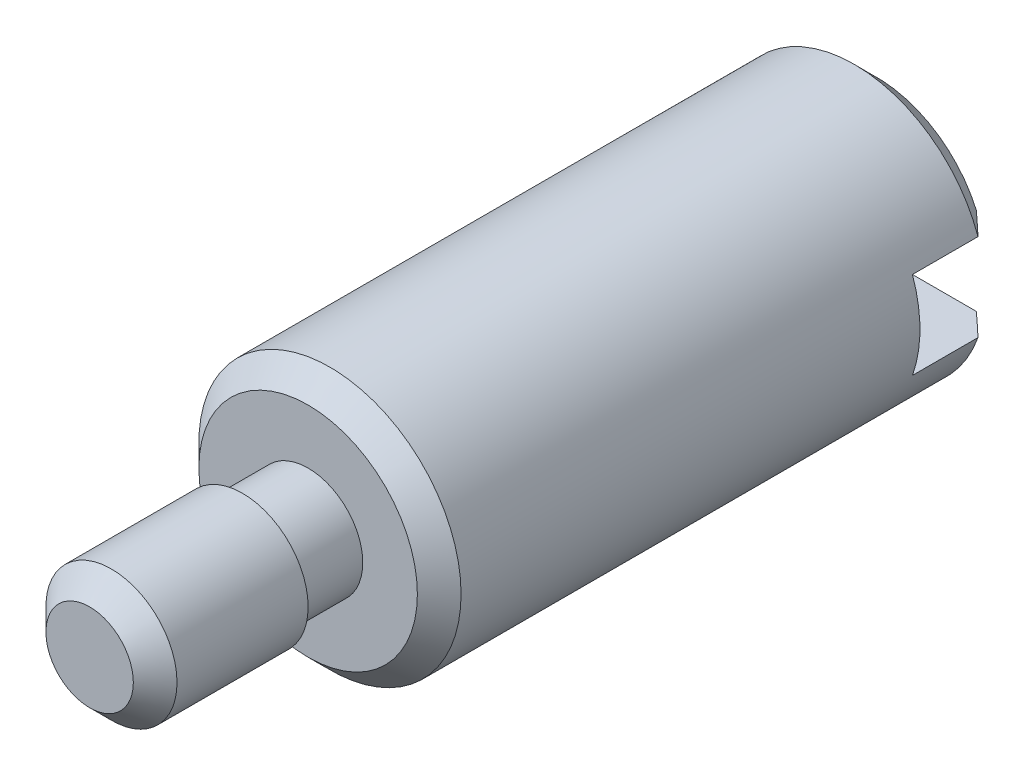
ISO-10303-21;
HEADER;
FILE_DESCRIPTION(('STEP AP214'),'2;1');
FILE_NAME('part.step','',(''),(''),'','','');
FILE_SCHEMA(('AUTOMOTIVE_DESIGN { 1 0 10303 214 1 1 1 1 }'));
ENDSEC;
DATA;
#1=APPLICATION_CONTEXT('core data for automotive mechanical design processes');
#2=APPLICATION_PROTOCOL_DEFINITION('international standard','automotive_design',2000,#1);
#3=PRODUCT_CONTEXT('',#1,'mechanical');
#4=PRODUCT('Part','Part','',(#3));
#5=PRODUCT_RELATED_PRODUCT_CATEGORY('part','',(#4));
#6=PRODUCT_DEFINITION_FORMATION('','',#4);
#7=PRODUCT_DEFINITION_CONTEXT('part definition',#1,'design');
#8=PRODUCT_DEFINITION('design','',#6,#7);
#9=PRODUCT_DEFINITION_SHAPE('','',#8);
#10=(LENGTH_UNIT() NAMED_UNIT(*) SI_UNIT(.MILLI.,.METRE.));
#11=(NAMED_UNIT(*) PLANE_ANGLE_UNIT() SI_UNIT($,.RADIAN.));
#12=(NAMED_UNIT(*) SI_UNIT($,.STERADIAN.) SOLID_ANGLE_UNIT());
#13=UNCERTAINTY_MEASURE_WITH_UNIT(LENGTH_MEASURE(1.E-05),#10,'distance_accuracy_value','');
#14=(GEOMETRIC_REPRESENTATION_CONTEXT(3) GLOBAL_UNCERTAINTY_ASSIGNED_CONTEXT((#13)) GLOBAL_UNIT_ASSIGNED_CONTEXT((#10,
#11,#12)) REPRESENTATION_CONTEXT('',''));
#15=CARTESIAN_POINT('',(0.,0.,0.));
#16=DIRECTION('',(0.,0.,1.));
#17=DIRECTION('',(1.,0.,0.));
#18=AXIS2_PLACEMENT_3D('',#15,#16,#17);
#19=CARTESIAN_POINT('',(0.,0.,0.));
#20=DIRECTION('',(0.,0.,1.));
#21=DIRECTION('',(1.,0.,0.));
#22=AXIS2_PLACEMENT_3D('',#19,#20,#21);
#23=PLANE('',#22);
#24=DIRECTION('',(1.,0.,0.));
#25=VECTOR('',#24,1.);
#26=CARTESIAN_POINT('',(-10.,-1.,0.));
#27=LINE('',#26,#25);
#28=CARTESIAN_POINT('',(-2.29128784747791,-1.,0.));
#29=VERTEX_POINT('',#28);
#30=CARTESIAN_POINT('',(2.29128784747791,-1.,0.));
#31=VERTEX_POINT('',#30);
#32=EDGE_CURVE('E139',#29,#31,#27,.T.);
#33=ORIENTED_EDGE('',*,*,#32,.T.);
#34=CARTESIAN_POINT('',(0.,0.,0.));
#35=DIRECTION('',(0.,0.,1.));
#36=DIRECTION('',(1.,0.,0.));
#37=AXIS2_PLACEMENT_3D('',#34,#35,#36);
#38=CIRCLE('',#37,2.49999999999999);
#39=EDGE_CURVE('E148',#31,#29,#38,.F.);
#40=ORIENTED_EDGE('',*,*,#39,.T.);
#41=EDGE_LOOP('',(#33,#40));
#42=FACE_BOUND('',#41,.T.);
#43=ADVANCED_FACE('F39',(#42),#23,.F.);
#44=CARTESIAN_POINT('',(0.,0.,18.));
#45=DIRECTION('',(0.,0.,-1.));
#46=DIRECTION('',(-1.,0.,0.));
#47=AXIS2_PLACEMENT_3D('',#44,#45,#46);
#48=CYLINDRICAL_SURFACE('',#47,1.5);
#49=CARTESIAN_POINT('',(0.,0.,14.5));
#50=DIRECTION('',(0.,0.,1.));
#51=DIRECTION('',(1.,0.,0.));
#52=AXIS2_PLACEMENT_3D('',#49,#50,#51);
#53=CIRCLE('',#52,1.5);
#54=CARTESIAN_POINT('',(1.5,0.,14.5));
#55=VERTEX_POINT('',#54);
#56=EDGE_CURVE('E132',#55,#55,#53,.T.);
#57=ORIENTED_EDGE('',*,*,#56,.T.);
#58=EDGE_LOOP('',(#57));
#59=FACE_BOUND('',#58,.T.);
#60=CARTESIAN_POINT('',(0.,0.,17.5));
#61=DIRECTION('',(0.,0.,1.));
#62=DIRECTION('',(1.,0.,0.));
#63=AXIS2_PLACEMENT_3D('',#60,#61,#62);
#64=CIRCLE('',#63,1.5);
#65=CARTESIAN_POINT('',(1.5,0.,17.5));
#66=VERTEX_POINT('',#65);
#67=EDGE_CURVE('E125',#66,#66,#64,.F.);
#68=ORIENTED_EDGE('',*,*,#67,.T.);
#69=EDGE_LOOP('',(#68));
#70=FACE_BOUND('',#69,.T.);
#71=ADVANCED_FACE('F196',(#59,#70),#48,.T.);
#72=CARTESIAN_POINT('',(0.,0.,18.));
#73=DIRECTION('',(0.,0.,1.));
#74=DIRECTION('',(1.,0.,0.));
#75=AXIS2_PLACEMENT_3D('',#72,#73,#74);
#76=PLANE('',#75);
#77=CARTESIAN_POINT('',(0.,0.,18.));
#78=DIRECTION('',(0.,0.,1.));
#79=DIRECTION('',(1.,0.,0.));
#80=AXIS2_PLACEMENT_3D('',#77,#78,#79);
#81=CIRCLE('',#80,0.999999999999997);
#82=CARTESIAN_POINT('',(0.999999999999997,0.,18.));
#83=VERTEX_POINT('',#82);
#84=EDGE_CURVE('E127',#83,#83,#81,.T.);
#85=ORIENTED_EDGE('',*,*,#84,.T.);
#86=EDGE_LOOP('',(#85));
#87=FACE_BOUND('',#86,.T.);
#88=ADVANCED_FACE('F193',(#87),#76,.T.);
#89=CARTESIAN_POINT('',(0.,0.,18.));
#90=DIRECTION('',(0.,0.,-1.));
#91=DIRECTION('',(-1.,0.,0.));
#92=AXIS2_PLACEMENT_3D('',#89,#90,#91);
#93=CONICAL_SURFACE('',#92,0.999999999999997,0.785398163397447);
#94=ORIENTED_EDGE('',*,*,#67,.F.);
#95=EDGE_LOOP('',(#94));
#96=FACE_BOUND('',#95,.T.);
#97=ORIENTED_EDGE('',*,*,#84,.F.);
#98=EDGE_LOOP('',(#97));
#99=FACE_BOUND('',#98,.T.);
#100=ADVANCED_FACE('F191',(#96,#99),#93,.T.);
#101=CARTESIAN_POINT('',(0.,0.,14.5));
#102=DIRECTION('',(0.,0.,1.));
#103=DIRECTION('',(1.,0.,0.));
#104=AXIS2_PLACEMENT_3D('',#101,#102,#103);
#105=PLANE('',#104);
#106=ORIENTED_EDGE('',*,*,#56,.F.);
#107=EDGE_LOOP('',(#106));
#108=FACE_BOUND('',#107,.T.);
#109=CARTESIAN_POINT('',(0.,0.,14.5));
#110=DIRECTION('',(0.,0.,1.));
#111=DIRECTION('',(1.,0.,0.));
#112=AXIS2_PLACEMENT_3D('',#109,#110,#111);
#113=CIRCLE('',#112,1.25);
#114=CARTESIAN_POINT('',(1.25,0.,14.5));
#115=VERTEX_POINT('',#114);
#116=EDGE_CURVE('E135',#115,#115,#113,.T.);
#117=ORIENTED_EDGE('',*,*,#116,.T.);
#118=EDGE_LOOP('',(#117));
#119=FACE_BOUND('',#118,.T.);
#120=ADVANCED_FACE('F187',(#108,#119),#105,.F.);
#121=CARTESIAN_POINT('',(0.,0.,14.5));
#122=DIRECTION('',(0.,0.,-1.));
#123=DIRECTION('',(-1.,0.,0.));
#124=AXIS2_PLACEMENT_3D('',#121,#122,#123);
#125=CYLINDRICAL_SURFACE('',#124,1.25);
#126=ORIENTED_EDGE('',*,*,#116,.F.);
#127=EDGE_LOOP('',(#126));
#128=FACE_BOUND('',#127,.T.);
#129=CARTESIAN_POINT('',(0.,0.,13.));
#130=DIRECTION('',(0.,0.,1.));
#131=DIRECTION('',(1.,0.,0.));
#132=AXIS2_PLACEMENT_3D('',#129,#130,#131);
#133=CIRCLE('',#132,1.25);
#134=CARTESIAN_POINT('',(1.25,0.,13.));
#135=VERTEX_POINT('',#134);
#136=EDGE_CURVE('E136',#135,#135,#133,.T.);
#137=ORIENTED_EDGE('',*,*,#136,.T.);
#138=EDGE_LOOP('',(#137));
#139=FACE_BOUND('',#138,.T.);
#140=ADVANCED_FACE('F182',(#128,#139),#125,.T.);
#141=DIRECTION('',(1.,0.,0.));
#142=VECTOR('',#141,1.);
#143=CARTESIAN_POINT('',(-10.,1.,0.));
#144=LINE('',#143,#142);
#145=CARTESIAN_POINT('',(-2.29128784747791,1.,0.));
#146=VERTEX_POINT('',#145);
#147=CARTESIAN_POINT('',(2.29128784747791,1.,0.));
#148=VERTEX_POINT('',#147);
#149=EDGE_CURVE('E112',#146,#148,#144,.T.);
#150=ORIENTED_EDGE('',*,*,#149,.F.);
#151=CARTESIAN_POINT('',(0.,0.,0.));
#152=DIRECTION('',(0.,0.,1.));
#153=DIRECTION('',(1.,0.,0.));
#154=AXIS2_PLACEMENT_3D('',#151,#152,#153);
#155=CIRCLE('',#154,2.49999999999999);
#156=EDGE_CURVE('E47',#146,#148,#155,.F.);
#157=ORIENTED_EDGE('',*,*,#156,.T.);
#158=EDGE_LOOP('',(#150,#157));
#159=FACE_BOUND('',#158,.T.);
#160=ADVANCED_FACE('F186',(#159),#23,.F.);
#161=CARTESIAN_POINT('',(0.,0.,13.));
#162=DIRECTION('',(0.,0.,-1.));
#163=DIRECTION('',(-1.,0.,0.));
#164=AXIS2_PLACEMENT_3D('',#161,#162,#163);
#165=CYLINDRICAL_SURFACE('',#164,3.);
#166=CARTESIAN_POINT('',(0.,0.,12.5));
#167=DIRECTION('',(0.,0.,1.));
#168=DIRECTION('',(1.,0.,0.));
#169=AXIS2_PLACEMENT_3D('',#166,#167,#168);
#170=CIRCLE('',#169,3.);
#171=CARTESIAN_POINT('',(3.,0.,12.5));
#172=VERTEX_POINT('',#171);
#173=EDGE_CURVE('E120',#172,#172,#170,.F.);
#174=ORIENTED_EDGE('',*,*,#173,.T.);
#175=EDGE_LOOP('',(#174));
#176=FACE_BOUND('',#175,.T.);
#177=DIRECTION('',(0.,0.,-1.));
#178=VECTOR('',#177,1.);
#179=CARTESIAN_POINT('',(-2.82842712474619,-1.,13.));
#180=LINE('',#179,#178);
#181=CARTESIAN_POINT('',(-2.82842712474619,-1.,2.));
#182=VERTEX_POINT('',#181);
#183=CARTESIAN_POINT('',(-2.82842712474619,-1.,0.500000000000014));
#184=VERTEX_POINT('',#183);
#185=EDGE_CURVE('E102',#182,#184,#180,.T.);
#186=ORIENTED_EDGE('',*,*,#185,.T.);
#187=CARTESIAN_POINT('',(0.,0.,0.500000000000011));
#188=DIRECTION('',(0.,0.,1.));
#189=DIRECTION('',(1.,0.,0.));
#190=AXIS2_PLACEMENT_3D('',#187,#188,#189);
#191=CIRCLE('',#190,3.);
#192=CARTESIAN_POINT('',(2.82842712474619,-1.,0.500000000000014));
#193=VERTEX_POINT('',#192);
#194=EDGE_CURVE('E221',#184,#193,#191,.T.);
#195=ORIENTED_EDGE('',*,*,#194,.T.);
#196=DIRECTION('',(0.,0.,-1.));
#197=VECTOR('',#196,1.);
#198=CARTESIAN_POINT('',(2.82842712474619,-1.,13.));
#199=LINE('',#198,#197);
#200=CARTESIAN_POINT('',(2.82842712474619,-1.,2.));
#201=VERTEX_POINT('',#200);
#202=EDGE_CURVE('E118',#193,#201,#199,.F.);
#203=ORIENTED_EDGE('',*,*,#202,.T.);
#204=CARTESIAN_POINT('',(0.,0.,2.));
#205=DIRECTION('',(0.,0.,1.));
#206=DIRECTION('',(0.,-1.,0.));
#207=AXIS2_PLACEMENT_3D('',#204,#205,#206);
#208=CIRCLE('',#207,3.);
#209=CARTESIAN_POINT('',(2.82842712474619,1.,2.));
#210=VERTEX_POINT('',#209);
#211=EDGE_CURVE('E101',#201,#210,#208,.T.);
#212=ORIENTED_EDGE('',*,*,#211,.T.);
#213=DIRECTION('',(0.,0.,-1.));
#214=VECTOR('',#213,1.);
#215=CARTESIAN_POINT('',(2.82842712474619,0.999999999999999,13.));
#216=LINE('',#215,#214);
#217=CARTESIAN_POINT('',(2.82842712474619,0.999999999999999,0.500000000000014));
#218=VERTEX_POINT('',#217);
#219=EDGE_CURVE('E90',#210,#218,#216,.T.);
#220=ORIENTED_EDGE('',*,*,#219,.T.);
#221=CARTESIAN_POINT('',(0.,0.,0.500000000000011));
#222=DIRECTION('',(0.,0.,1.));
#223=DIRECTION('',(1.,0.,0.));
#224=AXIS2_PLACEMENT_3D('',#221,#222,#223);
#225=CIRCLE('',#224,3.);
#226=CARTESIAN_POINT('',(-2.82842712474619,0.999999999999999,0.500000000000014));
#227=VERTEX_POINT('',#226);
#228=EDGE_CURVE('E310',#218,#227,#225,.T.);
#229=ORIENTED_EDGE('',*,*,#228,.T.);
#230=DIRECTION('',(0.,0.,-1.));
#231=VECTOR('',#230,1.);
#232=CARTESIAN_POINT('',(-2.82842712474619,0.999999999999999,13.));
#233=LINE('',#232,#231);
#234=CARTESIAN_POINT('',(-2.82842712474619,0.999999999999999,2.));
#235=VERTEX_POINT('',#234);
#236=EDGE_CURVE('E124',#227,#235,#233,.F.);
#237=ORIENTED_EDGE('',*,*,#236,.T.);
#238=EDGE_CURVE('E110',#235,#182,#208,.T.);
#239=ORIENTED_EDGE('',*,*,#238,.T.);
#240=EDGE_LOOP('',(#186,#195,#203,#212,#220,#229,#237,#239));
#241=FACE_BOUND('',#240,.T.);
#242=ADVANCED_FACE('F115',(#176,#241),#165,.T.);
#243=CARTESIAN_POINT('',(0.,0.,13.));
#244=DIRECTION('',(0.,0.,1.));
#245=DIRECTION('',(1.,0.,0.));
#246=AXIS2_PLACEMENT_3D('',#243,#244,#245);
#247=PLANE('',#246);
#248=CARTESIAN_POINT('',(0.,0.,13.));
#249=DIRECTION('',(0.,0.,1.));
#250=DIRECTION('',(1.,0.,0.));
#251=AXIS2_PLACEMENT_3D('',#248,#249,#250);
#252=CIRCLE('',#251,2.50000000000001);
#253=CARTESIAN_POINT('',(2.50000000000001,0.,13.));
#254=VERTEX_POINT('',#253);
#255=EDGE_CURVE('E11',#254,#254,#252,.T.);
#256=ORIENTED_EDGE('',*,*,#255,.T.);
#257=EDGE_LOOP('',(#256));
#258=FACE_BOUND('',#257,.T.);
#259=ORIENTED_EDGE('',*,*,#136,.F.);
#260=EDGE_LOOP('',(#259));
#261=FACE_BOUND('',#260,.T.);
#262=ADVANCED_FACE('F201',(#258,#261),#247,.T.);
#263=CARTESIAN_POINT('',(-10.,-1.,0.));
#264=DIRECTION('',(0.,-1.,0.));
#265=DIRECTION('',(0.,0.,-1.));
#266=AXIS2_PLACEMENT_3D('',#263,#264,#265);
#267=PLANE('',#266);
#268=ORIENTED_EDGE('',*,*,#202,.F.);
#269=CARTESIAN_POINT('',(2.82842712474619,-1.,0.500000000000011));
#270=CARTESIAN_POINT('',(2.78393060243607,-1.,0.458049299682906));
#271=CARTESIAN_POINT('',(2.73938013855693,-1.,0.41615570507989));
#272=CARTESIAN_POINT('',(2.65015403367117,-1.,0.332503146617479));
#273=CARTESIAN_POINT('',(2.60547839420256,-1.,0.290744181117356));
#274=CARTESIAN_POINT('',(2.51598341720938,-1.,0.207380143208971));
#275=CARTESIAN_POINT('',(2.47116407923847,-1.,0.165775071279567));
#276=CARTESIAN_POINT('',(2.38135760243372,-1.,0.0827453555177423));
#277=CARTESIAN_POINT('',(2.33637046155037,-1.,0.0413207139025482));
#278=CARTESIAN_POINT('',(2.29128784747791,-1.,0.));
#279=B_SPLINE_CURVE_WITH_KNOTS('',3,(#269,#270,#271,#272,#273,#274,#275,#276,#277,#278),
.UNSPECIFIED.,.F.,.F.,(4,2,2,2,4),(0.,0.183461811793641,0.366921379215909,0.550381517014313,
0.733843902947423),.UNSPECIFIED.);
#280=EDGE_CURVE('E154',#193,#31,#279,.T.);
#281=ORIENTED_EDGE('',*,*,#280,.T.);
#282=ORIENTED_EDGE('',*,*,#32,.F.);
#283=CARTESIAN_POINT('',(-2.29128784747791,-1.,0.));
#284=CARTESIAN_POINT('',(-2.33637046155037,-1.,0.0413207139025483));
#285=CARTESIAN_POINT('',(-2.38135760243373,-1.,0.0827453555177421));
#286=CARTESIAN_POINT('',(-2.47116407923847,-1.,0.165775071279567));
#287=CARTESIAN_POINT('',(-2.51598341720938,-1.,0.207380143208971));
#288=CARTESIAN_POINT('',(-2.60547839420256,-1.,0.290744181117356));
#289=CARTESIAN_POINT('',(-2.65015403367117,-1.,0.332503146617479));
#290=CARTESIAN_POINT('',(-2.73938013855693,-1.,0.416155705079889));
#291=CARTESIAN_POINT('',(-2.78393060243607,-1.,0.458049299682905));
#292=CARTESIAN_POINT('',(-2.82842712474619,-1.,0.50000000000001));
#293=B_SPLINE_CURVE_WITH_KNOTS('',3,(#283,#284,#285,#286,#287,#288,#289,#290,#291,#292),
.UNSPECIFIED.,.F.,.F.,(4,2,2,2,4),(0.,0.18346238593311,0.366922523731514,0.550382091153782,
0.733843902947423),.UNSPECIFIED.);
#294=EDGE_CURVE('E155',#29,#184,#293,.T.);
#295=ORIENTED_EDGE('',*,*,#294,.T.);
#296=ORIENTED_EDGE('',*,*,#185,.F.);
#297=DIRECTION('',(1.,0.,0.));
#298=VECTOR('',#297,1.);
#299=CARTESIAN_POINT('',(-10.,-1.,2.));
#300=LINE('',#299,#298);
#301=EDGE_CURVE('E111',#182,#201,#300,.T.);
#302=ORIENTED_EDGE('',*,*,#301,.T.);
#303=EDGE_LOOP('',(#268,#281,#282,#295,#296,#302));
#304=FACE_BOUND('',#303,.T.);
#305=ADVANCED_FACE('F204',(#304),#267,.F.);
#306=CARTESIAN_POINT('',(-10.,1.,2.));
#307=DIRECTION('',(0.,0.,1.));
#308=DIRECTION('',(0.,-1.,0.));
#309=AXIS2_PLACEMENT_3D('',#306,#307,#308);
#310=PLANE('',#309);
#311=ORIENTED_EDGE('',*,*,#301,.F.);
#312=ORIENTED_EDGE('',*,*,#238,.F.);
#313=DIRECTION('',(1.,0.,0.));
#314=VECTOR('',#313,1.);
#315=CARTESIAN_POINT('',(-10.,1.,2.));
#316=LINE('',#315,#314);
#317=EDGE_CURVE('E93',#235,#210,#316,.T.);
#318=ORIENTED_EDGE('',*,*,#317,.T.);
#319=ORIENTED_EDGE('',*,*,#211,.F.);
#320=EDGE_LOOP('',(#311,#312,#318,#319));
#321=FACE_BOUND('',#320,.T.);
#322=ADVANCED_FACE('F107',(#321),#310,.F.);
#323=CARTESIAN_POINT('',(-10.,1.,0.));
#324=DIRECTION('',(0.,1.,0.));
#325=DIRECTION('',(0.,0.,1.));
#326=AXIS2_PLACEMENT_3D('',#323,#324,#325);
#327=PLANE('',#326);
#328=ORIENTED_EDGE('',*,*,#236,.F.);
#329=CARTESIAN_POINT('',(-2.82842712474619,0.999999999999999,0.500000000000011));
#330=CARTESIAN_POINT('',(-2.78393060243607,1.,0.458049299682906));
#331=CARTESIAN_POINT('',(-2.73938013855693,1.,0.41615570507989));
#332=CARTESIAN_POINT('',(-2.65015403367117,1.,0.332503146617479));
#333=CARTESIAN_POINT('',(-2.60547839420256,1.,0.290744181117356));
#334=CARTESIAN_POINT('',(-2.51598341720938,1.,0.207380143208971));
#335=CARTESIAN_POINT('',(-2.47116407923847,1.,0.165775071279567));
#336=CARTESIAN_POINT('',(-2.38135760243373,1.,0.0827453555177421));
#337=CARTESIAN_POINT('',(-2.33637046155037,1.,0.0413207139025482));
#338=CARTESIAN_POINT('',(-2.29128784747791,1.,0.));
#339=B_SPLINE_CURVE_WITH_KNOTS('',3,(#329,#330,#331,#332,#333,#334,#335,#336,#337,#338),
.UNSPECIFIED.,.F.,.F.,(4,2,2,2,4),(0.,0.183461811793641,0.366921379215909,0.550381517014314,
0.733843902947424),.UNSPECIFIED.);
#340=EDGE_CURVE('E59',#227,#146,#339,.T.);
#341=ORIENTED_EDGE('',*,*,#340,.T.);
#342=ORIENTED_EDGE('',*,*,#149,.T.);
#343=CARTESIAN_POINT('',(2.29128784747791,1.,0.));
#344=CARTESIAN_POINT('',(2.33637046155037,1.,0.0413207139025483));
#345=CARTESIAN_POINT('',(2.38135760243373,1.,0.0827453555177421));
#346=CARTESIAN_POINT('',(2.47116407923847,1.,0.165775071279567));
#347=CARTESIAN_POINT('',(2.51598341720938,1.,0.207380143208971));
#348=CARTESIAN_POINT('',(2.60547839420256,1.,0.290744181117356));
#349=CARTESIAN_POINT('',(2.65015403367117,1.,0.332503146617479));
#350=CARTESIAN_POINT('',(2.73938013855693,1.,0.416155705079889));
#351=CARTESIAN_POINT('',(2.78393060243607,1.,0.458049299682906));
#352=CARTESIAN_POINT('',(2.82842712474619,1.,0.500000000000011));
#353=B_SPLINE_CURVE_WITH_KNOTS('',3,(#343,#344,#345,#346,#347,#348,#349,#350,#351,#352),
.UNSPECIFIED.,.F.,.F.,(4,2,2,2,4),(0.,0.18346238593311,0.366922523731514,0.550382091153782,
0.733843902947424),.UNSPECIFIED.);
#354=EDGE_CURVE('E96',#148,#218,#353,.T.);
#355=ORIENTED_EDGE('',*,*,#354,.T.);
#356=ORIENTED_EDGE('',*,*,#219,.F.);
#357=ORIENTED_EDGE('',*,*,#317,.F.);
#358=EDGE_LOOP('',(#328,#341,#342,#355,#356,#357));
#359=FACE_BOUND('',#358,.T.);
#360=ADVANCED_FACE('F92',(#359),#327,.F.);
#361=CARTESIAN_POINT('',(0.,0.,0.500000000000011));
#362=DIRECTION('',(0.,0.,1.));
#363=DIRECTION('',(1.,0.,0.));
#364=AXIS2_PLACEMENT_3D('',#361,#362,#363);
#365=CONICAL_SURFACE('',#364,3.,0.78539816339745);
#366=ORIENTED_EDGE('',*,*,#294,.F.);
#367=ORIENTED_EDGE('',*,*,#39,.F.);
#368=ORIENTED_EDGE('',*,*,#280,.F.);
#369=ORIENTED_EDGE('',*,*,#194,.F.);
#370=EDGE_LOOP('',(#366,#367,#368,#369));
#371=FACE_BOUND('',#370,.T.);
#372=ADVANCED_FACE('F152',(#371),#365,.T.);
#373=CARTESIAN_POINT('',(0.,0.,0.500000000000011));
#374=DIRECTION('',(0.,0.,1.));
#375=DIRECTION('',(1.,0.,0.));
#376=AXIS2_PLACEMENT_3D('',#373,#374,#375);
#377=CONICAL_SURFACE('',#376,3.,0.78539816339745);
#378=ORIENTED_EDGE('',*,*,#354,.F.);
#379=ORIENTED_EDGE('',*,*,#156,.F.);
#380=ORIENTED_EDGE('',*,*,#340,.F.);
#381=ORIENTED_EDGE('',*,*,#228,.F.);
#382=EDGE_LOOP('',(#378,#379,#380,#381));
#383=FACE_BOUND('',#382,.T.);
#384=ADVANCED_FACE('F176',(#383),#377,.T.);
#385=CARTESIAN_POINT('',(0.,0.,13.));
#386=DIRECTION('',(0.,0.,-1.));
#387=DIRECTION('',(-1.,0.,0.));
#388=AXIS2_PLACEMENT_3D('',#385,#386,#387);
#389=CONICAL_SURFACE('',#388,2.50000000000001,0.785398163397448);
#390=ORIENTED_EDGE('',*,*,#173,.F.);
#391=EDGE_LOOP('',(#390));
#392=FACE_BOUND('',#391,.T.);
#393=ORIENTED_EDGE('',*,*,#255,.F.);
#394=EDGE_LOOP('',(#393));
#395=FACE_BOUND('',#394,.T.);
#396=ADVANCED_FACE('F41',(#392,#395),#389,.T.);
#397=CLOSED_SHELL('',(#43,#71,#88,#100,#120,#140,#160,#242,#262,#305,#322,#360,#372,#384,#396));
#398=MANIFOLD_SOLID_BREP('B2',#397);
#399=ADVANCED_BREP_SHAPE_REPRESENTATION('',(#18,#398),#14);
#400=SHAPE_DEFINITION_REPRESENTATION(#9,#399);
ENDSEC;
END-ISO-10303-21;
